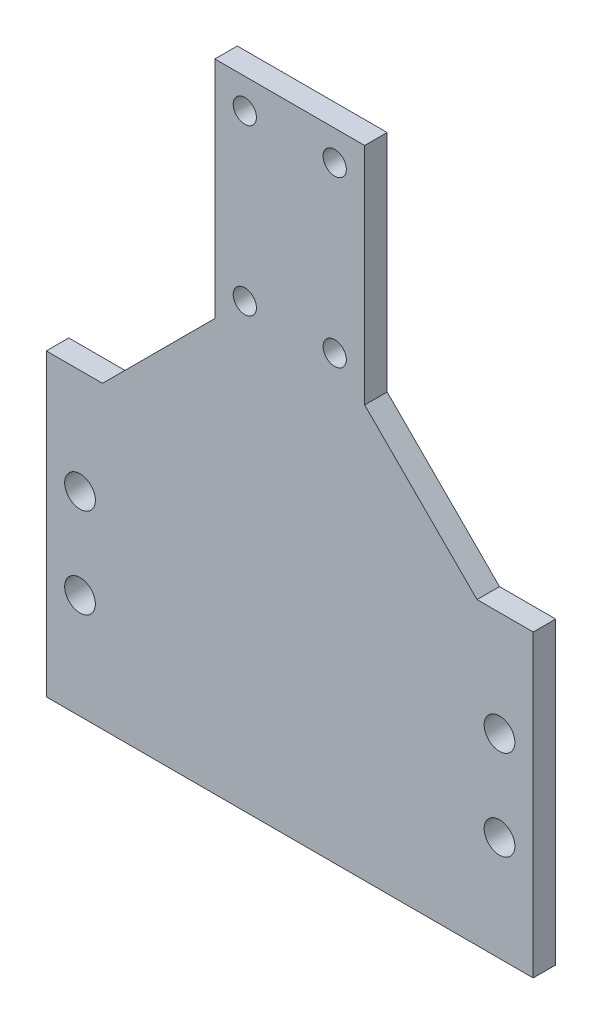
ISO-10303-21;
HEADER;
FILE_DESCRIPTION(('STEP AP214'),'2;1');
FILE_NAME('part.step','',(''),(''),'','','');
FILE_SCHEMA(('AUTOMOTIVE_DESIGN { 1 0 10303 214 1 1 1 1 }'));
ENDSEC;
DATA;
#1=APPLICATION_CONTEXT('core data for automotive mechanical design processes');
#2=APPLICATION_PROTOCOL_DEFINITION('international standard','automotive_design',2000,#1);
#3=PRODUCT_CONTEXT('',#1,'mechanical');
#4=PRODUCT('Part','Part','',(#3));
#5=PRODUCT_RELATED_PRODUCT_CATEGORY('part','',(#4));
#6=PRODUCT_DEFINITION_FORMATION('','',#4);
#7=PRODUCT_DEFINITION_CONTEXT('part definition',#1,'design');
#8=PRODUCT_DEFINITION('design','',#6,#7);
#9=PRODUCT_DEFINITION_SHAPE('','',#8);
#10=(LENGTH_UNIT() NAMED_UNIT(*) SI_UNIT(.MILLI.,.METRE.));
#11=(NAMED_UNIT(*) PLANE_ANGLE_UNIT() SI_UNIT($,.RADIAN.));
#12=(NAMED_UNIT(*) SI_UNIT($,.STERADIAN.) SOLID_ANGLE_UNIT());
#13=UNCERTAINTY_MEASURE_WITH_UNIT(LENGTH_MEASURE(1.E-05),#10,'distance_accuracy_value','');
#14=(GEOMETRIC_REPRESENTATION_CONTEXT(3) GLOBAL_UNCERTAINTY_ASSIGNED_CONTEXT((#13)) GLOBAL_UNIT_ASSIGNED_CONTEXT((#10,
#11,#12)) REPRESENTATION_CONTEXT('',''));
#15=CARTESIAN_POINT('',(0.,0.,0.));
#16=DIRECTION('',(0.,0.,1.));
#17=DIRECTION('',(1.,0.,0.));
#18=AXIS2_PLACEMENT_3D('',#15,#16,#17);
#19=CARTESIAN_POINT('',(-32.5,40.,3.));
#20=DIRECTION('',(1.,0.,0.));
#21=DIRECTION('',(0.,1.,0.));
#22=AXIS2_PLACEMENT_3D('',#19,#20,#21);
#23=PLANE('',#22);
#24=DIRECTION('',(0.,-1.,0.));
#25=VECTOR('',#24,1.);
#26=CARTESIAN_POINT('',(-32.5,40.,0.));
#27=LINE('',#26,#25);
#28=CARTESIAN_POINT('',(-32.5,40.,0.));
#29=VERTEX_POINT('',#28);
#30=CARTESIAN_POINT('',(-32.5,0.,0.));
#31=VERTEX_POINT('',#30);
#32=EDGE_CURVE('E149',#29,#31,#27,.T.);
#33=ORIENTED_EDGE('',*,*,#32,.T.);
#34=DIRECTION('',(0.,0.,-1.));
#35=VECTOR('',#34,1.);
#36=CARTESIAN_POINT('',(-32.5,0.,3.));
#37=LINE('',#36,#35);
#38=CARTESIAN_POINT('',(-32.5,0.,3.));
#39=VERTEX_POINT('',#38);
#40=EDGE_CURVE('E11',#39,#31,#37,.T.);
#41=ORIENTED_EDGE('',*,*,#40,.F.);
#42=DIRECTION('',(0.,-1.,0.));
#43=VECTOR('',#42,1.);
#44=CARTESIAN_POINT('',(-32.5,40.,3.));
#45=LINE('',#44,#43);
#46=CARTESIAN_POINT('',(-32.5,40.,3.));
#47=VERTEX_POINT('',#46);
#48=EDGE_CURVE('E168',#47,#39,#45,.T.);
#49=ORIENTED_EDGE('',*,*,#48,.F.);
#50=DIRECTION('',(0.,0.,-1.));
#51=VECTOR('',#50,1.);
#52=CARTESIAN_POINT('',(-32.5,40.,3.));
#53=LINE('',#52,#51);
#54=EDGE_CURVE('E145',#47,#29,#53,.T.);
#55=ORIENTED_EDGE('',*,*,#54,.T.);
#56=EDGE_LOOP('',(#33,#41,#49,#55));
#57=FACE_BOUND('',#56,.T.);
#58=ADVANCED_FACE('F41',(#57),#23,.F.);
#59=CARTESIAN_POINT('',(-32.5,0.,3.));
#60=DIRECTION('',(0.,1.,0.));
#61=DIRECTION('',(0.,0.,1.));
#62=AXIS2_PLACEMENT_3D('',#59,#60,#61);
#63=PLANE('',#62);
#64=DIRECTION('',(1.,0.,0.));
#65=VECTOR('',#64,1.);
#66=CARTESIAN_POINT('',(-32.5,0.,0.));
#67=LINE('',#66,#65);
#68=CARTESIAN_POINT('',(32.5,0.,0.));
#69=VERTEX_POINT('',#68);
#70=EDGE_CURVE('E152',#31,#69,#67,.T.);
#71=ORIENTED_EDGE('',*,*,#70,.T.);
#72=DIRECTION('',(0.,0.,-1.));
#73=VECTOR('',#72,1.);
#74=CARTESIAN_POINT('',(32.5,0.,3.));
#75=LINE('',#74,#73);
#76=CARTESIAN_POINT('',(32.5,0.,3.));
#77=VERTEX_POINT('',#76);
#78=EDGE_CURVE('E49',#77,#69,#75,.T.);
#79=ORIENTED_EDGE('',*,*,#78,.F.);
#80=DIRECTION('',(1.,0.,0.));
#81=VECTOR('',#80,1.);
#82=CARTESIAN_POINT('',(-32.5,0.,3.));
#83=LINE('',#82,#81);
#84=EDGE_CURVE('E106',#39,#77,#83,.T.);
#85=ORIENTED_EDGE('',*,*,#84,.F.);
#86=ORIENTED_EDGE('',*,*,#40,.T.);
#87=EDGE_LOOP('',(#71,#79,#85,#86));
#88=FACE_BOUND('',#87,.T.);
#89=ADVANCED_FACE('F297',(#88),#63,.F.);
#90=CARTESIAN_POINT('',(32.5,40.,3.));
#91=DIRECTION('',(-1.,0.,0.));
#92=DIRECTION('',(0.,-1.,0.));
#93=AXIS2_PLACEMENT_3D('',#90,#91,#92);
#94=PLANE('',#93);
#95=DIRECTION('',(0.,1.,0.));
#96=VECTOR('',#95,1.);
#97=CARTESIAN_POINT('',(32.5,40.,0.));
#98=LINE('',#97,#96);
#99=CARTESIAN_POINT('',(32.5,40.,0.));
#100=VERTEX_POINT('',#99);
#101=EDGE_CURVE('E155',#69,#100,#98,.T.);
#102=ORIENTED_EDGE('',*,*,#101,.T.);
#103=DIRECTION('',(0.,0.,-1.));
#104=VECTOR('',#103,1.);
#105=CARTESIAN_POINT('',(32.5,40.,3.));
#106=LINE('',#105,#104);
#107=CARTESIAN_POINT('',(32.5,40.,3.));
#108=VERTEX_POINT('',#107);
#109=EDGE_CURVE('E181',#108,#100,#106,.T.);
#110=ORIENTED_EDGE('',*,*,#109,.F.);
#111=DIRECTION('',(0.,1.,0.));
#112=VECTOR('',#111,1.);
#113=CARTESIAN_POINT('',(32.5,40.,3.));
#114=LINE('',#113,#112);
#115=EDGE_CURVE('E189',#77,#108,#114,.T.);
#116=ORIENTED_EDGE('',*,*,#115,.F.);
#117=ORIENTED_EDGE('',*,*,#78,.T.);
#118=EDGE_LOOP('',(#102,#110,#116,#117));
#119=FACE_BOUND('',#118,.T.);
#120=ADVANCED_FACE('F187',(#119),#94,.F.);
#121=CARTESIAN_POINT('',(32.5,40.,3.));
#122=DIRECTION('',(0.,-1.,0.));
#123=DIRECTION('',(0.,0.,-1.));
#124=AXIS2_PLACEMENT_3D('',#121,#122,#123);
#125=PLANE('',#124);
#126=DIRECTION('',(-1.,0.,0.));
#127=VECTOR('',#126,1.);
#128=CARTESIAN_POINT('',(32.5,40.,0.));
#129=LINE('',#128,#127);
#130=CARTESIAN_POINT('',(25.,40.,0.));
#131=VERTEX_POINT('',#130);
#132=EDGE_CURVE('E157',#100,#131,#129,.T.);
#133=ORIENTED_EDGE('',*,*,#132,.T.);
#134=DIRECTION('',(0.,0.,-1.));
#135=VECTOR('',#134,1.);
#136=CARTESIAN_POINT('',(25.,40.,3.));
#137=LINE('',#136,#135);
#138=CARTESIAN_POINT('',(25.,40.,3.));
#139=VERTEX_POINT('',#138);
#140=EDGE_CURVE('E178',#139,#131,#137,.T.);
#141=ORIENTED_EDGE('',*,*,#140,.F.);
#142=DIRECTION('',(-1.,0.,0.));
#143=VECTOR('',#142,1.);
#144=CARTESIAN_POINT('',(32.5,40.,3.));
#145=LINE('',#144,#143);
#146=EDGE_CURVE('E207',#108,#139,#145,.T.);
#147=ORIENTED_EDGE('',*,*,#146,.F.);
#148=ORIENTED_EDGE('',*,*,#109,.T.);
#149=EDGE_LOOP('',(#133,#141,#147,#148));
#150=FACE_BOUND('',#149,.T.);
#151=ADVANCED_FACE('F198',(#150),#125,.F.);
#152=CARTESIAN_POINT('',(25.,40.,3.));
#153=DIRECTION('',(-0.707106781186548,-0.707106781186547,0.));
#154=DIRECTION('',(0.707106781186547,-0.707106781186548,0.));
#155=AXIS2_PLACEMENT_3D('',#152,#153,#154);
#156=PLANE('',#155);
#157=DIRECTION('',(-0.707106781186547,0.707106781186548,0.));
#158=VECTOR('',#157,1.);
#159=CARTESIAN_POINT('',(25.,40.,0.));
#160=LINE('',#159,#158);
#161=CARTESIAN_POINT('',(10.,55.,0.));
#162=VERTEX_POINT('',#161);
#163=EDGE_CURVE('E159',#131,#162,#160,.T.);
#164=ORIENTED_EDGE('',*,*,#163,.T.);
#165=DIRECTION('',(0.,0.,-1.));
#166=VECTOR('',#165,1.);
#167=CARTESIAN_POINT('',(10.,55.,3.));
#168=LINE('',#167,#166);
#169=CARTESIAN_POINT('',(10.,55.,3.));
#170=VERTEX_POINT('',#169);
#171=EDGE_CURVE('E175',#170,#162,#168,.T.);
#172=ORIENTED_EDGE('',*,*,#171,.F.);
#173=DIRECTION('',(-0.707106781186547,0.707106781186548,0.));
#174=VECTOR('',#173,1.);
#175=CARTESIAN_POINT('',(25.,40.,3.));
#176=LINE('',#175,#174);
#177=EDGE_CURVE('E204',#139,#170,#176,.T.);
#178=ORIENTED_EDGE('',*,*,#177,.F.);
#179=ORIENTED_EDGE('',*,*,#140,.T.);
#180=EDGE_LOOP('',(#164,#172,#178,#179));
#181=FACE_BOUND('',#180,.T.);
#182=ADVANCED_FACE('F202',(#181),#156,.F.);
#183=CARTESIAN_POINT('',(10.,55.,3.));
#184=DIRECTION('',(-1.,0.,0.));
#185=DIRECTION('',(0.,-1.,0.));
#186=AXIS2_PLACEMENT_3D('',#183,#184,#185);
#187=PLANE('',#186);
#188=DIRECTION('',(0.,1.,0.));
#189=VECTOR('',#188,1.);
#190=CARTESIAN_POINT('',(10.,55.,0.));
#191=LINE('',#190,#189);
#192=CARTESIAN_POINT('',(10.,85.,0.));
#193=VERTEX_POINT('',#192);
#194=EDGE_CURVE('E161',#162,#193,#191,.T.);
#195=ORIENTED_EDGE('',*,*,#194,.T.);
#196=DIRECTION('',(0.,0.,-1.));
#197=VECTOR('',#196,1.);
#198=CARTESIAN_POINT('',(10.,85.,3.));
#199=LINE('',#198,#197);
#200=CARTESIAN_POINT('',(10.,85.,3.));
#201=VERTEX_POINT('',#200);
#202=EDGE_CURVE('E172',#201,#193,#199,.T.);
#203=ORIENTED_EDGE('',*,*,#202,.F.);
#204=DIRECTION('',(0.,1.,0.));
#205=VECTOR('',#204,1.);
#206=CARTESIAN_POINT('',(10.,55.,3.));
#207=LINE('',#206,#205);
#208=EDGE_CURVE('E206',#170,#201,#207,.T.);
#209=ORIENTED_EDGE('',*,*,#208,.F.);
#210=ORIENTED_EDGE('',*,*,#171,.T.);
#211=EDGE_LOOP('',(#195,#203,#209,#210));
#212=FACE_BOUND('',#211,.T.);
#213=ADVANCED_FACE('F309',(#212),#187,.F.);
#214=CARTESIAN_POINT('',(-10.,85.,3.));
#215=DIRECTION('',(0.,-1.,0.));
#216=DIRECTION('',(0.,0.,-1.));
#217=AXIS2_PLACEMENT_3D('',#214,#215,#216);
#218=PLANE('',#217);
#219=DIRECTION('',(-1.,0.,0.));
#220=VECTOR('',#219,1.);
#221=CARTESIAN_POINT('',(-10.,85.,0.));
#222=LINE('',#221,#220);
#223=CARTESIAN_POINT('',(-10.,85.,0.));
#224=VERTEX_POINT('',#223);
#225=EDGE_CURVE('E163',#193,#224,#222,.T.);
#226=ORIENTED_EDGE('',*,*,#225,.T.);
#227=DIRECTION('',(0.,0.,-1.));
#228=VECTOR('',#227,1.);
#229=CARTESIAN_POINT('',(-10.,85.,3.));
#230=LINE('',#229,#228);
#231=CARTESIAN_POINT('',(-10.,85.,3.));
#232=VERTEX_POINT('',#231);
#233=EDGE_CURVE('E140',#232,#224,#230,.T.);
#234=ORIENTED_EDGE('',*,*,#233,.F.);
#235=DIRECTION('',(-1.,0.,0.));
#236=VECTOR('',#235,1.);
#237=CARTESIAN_POINT('',(-10.,85.,3.));
#238=LINE('',#237,#236);
#239=EDGE_CURVE('E131',#201,#232,#238,.T.);
#240=ORIENTED_EDGE('',*,*,#239,.F.);
#241=ORIENTED_EDGE('',*,*,#202,.T.);
#242=EDGE_LOOP('',(#226,#234,#240,#241));
#243=FACE_BOUND('',#242,.T.);
#244=ADVANCED_FACE('F306',(#243),#218,.F.);
#245=CARTESIAN_POINT('',(-10.,55.,3.));
#246=DIRECTION('',(1.,0.,0.));
#247=DIRECTION('',(0.,1.,0.));
#248=AXIS2_PLACEMENT_3D('',#245,#246,#247);
#249=PLANE('',#248);
#250=DIRECTION('',(0.,-1.,0.));
#251=VECTOR('',#250,1.);
#252=CARTESIAN_POINT('',(-10.,55.,0.));
#253=LINE('',#252,#251);
#254=CARTESIAN_POINT('',(-10.,55.,0.));
#255=VERTEX_POINT('',#254);
#256=EDGE_CURVE('E139',#224,#255,#253,.T.);
#257=ORIENTED_EDGE('',*,*,#256,.T.);
#258=DIRECTION('',(0.,0.,-1.));
#259=VECTOR('',#258,1.);
#260=CARTESIAN_POINT('',(-10.,55.,3.));
#261=LINE('',#260,#259);
#262=CARTESIAN_POINT('',(-10.,55.,3.));
#263=VERTEX_POINT('',#262);
#264=EDGE_CURVE('E136',#263,#255,#261,.T.);
#265=ORIENTED_EDGE('',*,*,#264,.F.);
#266=DIRECTION('',(0.,-1.,0.));
#267=VECTOR('',#266,1.);
#268=CARTESIAN_POINT('',(-10.,55.,3.));
#269=LINE('',#268,#267);
#270=EDGE_CURVE('E125',#232,#263,#269,.T.);
#271=ORIENTED_EDGE('',*,*,#270,.F.);
#272=ORIENTED_EDGE('',*,*,#233,.T.);
#273=EDGE_LOOP('',(#257,#265,#271,#272));
#274=FACE_BOUND('',#273,.T.);
#275=ADVANCED_FACE('F137',(#274),#249,.F.);
#276=CARTESIAN_POINT('',(-25.,40.,3.));
#277=DIRECTION('',(0.707106781186548,-0.707106781186547,0.));
#278=DIRECTION('',(0.707106781186547,0.707106781186548,0.));
#279=AXIS2_PLACEMENT_3D('',#276,#277,#278);
#280=PLANE('',#279);
#281=DIRECTION('',(-0.707106781186547,-0.707106781186548,0.));
#282=VECTOR('',#281,1.);
#283=CARTESIAN_POINT('',(-25.,40.,0.));
#284=LINE('',#283,#282);
#285=CARTESIAN_POINT('',(-25.,40.,0.));
#286=VERTEX_POINT('',#285);
#287=EDGE_CURVE('E92',#255,#286,#284,.T.);
#288=ORIENTED_EDGE('',*,*,#287,.T.);
#289=DIRECTION('',(0.,0.,-1.));
#290=VECTOR('',#289,1.);
#291=CARTESIAN_POINT('',(-25.,40.,3.));
#292=LINE('',#291,#290);
#293=CARTESIAN_POINT('',(-25.,40.,3.));
#294=VERTEX_POINT('',#293);
#295=EDGE_CURVE('E141',#294,#286,#292,.T.);
#296=ORIENTED_EDGE('',*,*,#295,.F.);
#297=DIRECTION('',(-0.707106781186547,-0.707106781186548,0.));
#298=VECTOR('',#297,1.);
#299=CARTESIAN_POINT('',(-25.,40.,3.));
#300=LINE('',#299,#298);
#301=EDGE_CURVE('E129',#263,#294,#300,.T.);
#302=ORIENTED_EDGE('',*,*,#301,.F.);
#303=ORIENTED_EDGE('',*,*,#264,.T.);
#304=EDGE_LOOP('',(#288,#296,#302,#303));
#305=FACE_BOUND('',#304,.T.);
#306=ADVANCED_FACE('F143',(#305),#280,.F.);
#307=CARTESIAN_POINT('',(-32.5,40.,3.));
#308=DIRECTION('',(0.,-1.,0.));
#309=DIRECTION('',(0.,0.,-1.));
#310=AXIS2_PLACEMENT_3D('',#307,#308,#309);
#311=PLANE('',#310);
#312=DIRECTION('',(-1.,0.,0.));
#313=VECTOR('',#312,1.);
#314=CARTESIAN_POINT('',(-32.5,40.,0.));
#315=LINE('',#314,#313);
#316=EDGE_CURVE('E98',#286,#29,#315,.T.);
#317=ORIENTED_EDGE('',*,*,#316,.T.);
#318=ORIENTED_EDGE('',*,*,#54,.F.);
#319=DIRECTION('',(-1.,0.,0.));
#320=VECTOR('',#319,1.);
#321=CARTESIAN_POINT('',(-32.5,40.,3.));
#322=LINE('',#321,#320);
#323=EDGE_CURVE('E57',#294,#47,#322,.T.);
#324=ORIENTED_EDGE('',*,*,#323,.F.);
#325=ORIENTED_EDGE('',*,*,#295,.T.);
#326=EDGE_LOOP('',(#317,#318,#324,#325));
#327=FACE_BOUND('',#326,.T.);
#328=ADVANCED_FACE('F267',(#327),#311,.F.);
#329=CARTESIAN_POINT('',(0.,0.,3.));
#330=DIRECTION('',(0.,0.,1.));
#331=DIRECTION('',(1.,0.,0.));
#332=AXIS2_PLACEMENT_3D('',#329,#330,#331);
#333=PLANE('',#332);
#334=CARTESIAN_POINT('',(28.,26.,3.));
#335=DIRECTION('',(0.,0.,1.));
#336=DIRECTION('',(-1.,0.,0.));
#337=AXIS2_PLACEMENT_3D('',#334,#335,#336);
#338=CIRCLE('',#337,2.05);
#339=CARTESIAN_POINT('',(25.95,26.,3.));
#340=VERTEX_POINT('',#339);
#341=EDGE_CURVE('E248',#340,#340,#338,.T.);
#342=ORIENTED_EDGE('',*,*,#341,.F.);
#343=EDGE_LOOP('',(#342));
#344=FACE_BOUND('',#343,.T.);
#345=CARTESIAN_POINT('',(28.,14.,3.));
#346=DIRECTION('',(0.,0.,1.));
#347=DIRECTION('',(1.,0.,0.));
#348=AXIS2_PLACEMENT_3D('',#345,#346,#347);
#349=CIRCLE('',#348,2.05);
#350=CARTESIAN_POINT('',(30.05,14.,3.));
#351=VERTEX_POINT('',#350);
#352=EDGE_CURVE('E254',#351,#351,#349,.T.);
#353=ORIENTED_EDGE('',*,*,#352,.F.);
#354=EDGE_LOOP('',(#353));
#355=FACE_BOUND('',#354,.T.);
#356=CARTESIAN_POINT('',(-28.,14.,3.));
#357=DIRECTION('',(0.,0.,1.));
#358=DIRECTION('',(-1.,0.,0.));
#359=AXIS2_PLACEMENT_3D('',#356,#357,#358);
#360=CIRCLE('',#359,2.05);
#361=CARTESIAN_POINT('',(-30.05,14.,3.));
#362=VERTEX_POINT('',#361);
#363=EDGE_CURVE('E242',#362,#362,#360,.T.);
#364=ORIENTED_EDGE('',*,*,#363,.F.);
#365=EDGE_LOOP('',(#364));
#366=FACE_BOUND('',#365,.T.);
#367=CARTESIAN_POINT('',(-28.,26.,3.));
#368=DIRECTION('',(0.,0.,1.));
#369=DIRECTION('',(1.,0.,0.));
#370=AXIS2_PLACEMENT_3D('',#367,#368,#369);
#371=CIRCLE('',#370,2.05);
#372=CARTESIAN_POINT('',(-25.95,26.,3.));
#373=VERTEX_POINT('',#372);
#374=EDGE_CURVE('E239',#373,#373,#371,.T.);
#375=ORIENTED_EDGE('',*,*,#374,.F.);
#376=EDGE_LOOP('',(#375));
#377=FACE_BOUND('',#376,.T.);
#378=CARTESIAN_POINT('',(6.00000000000001,81.,3.));
#379=DIRECTION('',(0.,0.,1.));
#380=DIRECTION('',(-1.,0.,0.));
#381=AXIS2_PLACEMENT_3D('',#378,#379,#380);
#382=CIRCLE('',#381,1.54999999999999);
#383=CARTESIAN_POINT('',(4.45000000000001,81.,3.));
#384=VERTEX_POINT('',#383);
#385=EDGE_CURVE('E224',#384,#384,#382,.T.);
#386=ORIENTED_EDGE('',*,*,#385,.F.);
#387=EDGE_LOOP('',(#386));
#388=FACE_BOUND('',#387,.T.);
#389=CARTESIAN_POINT('',(6.00000000000001,59.,3.));
#390=DIRECTION('',(0.,0.,1.));
#391=DIRECTION('',(1.,0.,0.));
#392=AXIS2_PLACEMENT_3D('',#389,#390,#391);
#393=CIRCLE('',#392,1.55);
#394=CARTESIAN_POINT('',(7.55000000000001,59.,3.));
#395=VERTEX_POINT('',#394);
#396=EDGE_CURVE('E231',#395,#395,#393,.T.);
#397=ORIENTED_EDGE('',*,*,#396,.F.);
#398=EDGE_LOOP('',(#397));
#399=FACE_BOUND('',#398,.T.);
#400=CARTESIAN_POINT('',(-6.,59.,3.));
#401=DIRECTION('',(0.,0.,1.));
#402=DIRECTION('',(-1.,0.,0.));
#403=AXIS2_PLACEMENT_3D('',#400,#401,#402);
#404=CIRCLE('',#403,1.55);
#405=CARTESIAN_POINT('',(-7.55,59.,3.));
#406=VERTEX_POINT('',#405);
#407=EDGE_CURVE('E218',#406,#406,#404,.T.);
#408=ORIENTED_EDGE('',*,*,#407,.F.);
#409=EDGE_LOOP('',(#408));
#410=FACE_BOUND('',#409,.T.);
#411=CARTESIAN_POINT('',(-6.,81.,3.));
#412=DIRECTION('',(0.,0.,1.));
#413=DIRECTION('',(1.,0.,0.));
#414=AXIS2_PLACEMENT_3D('',#411,#412,#413);
#415=CIRCLE('',#414,1.54999999999999);
#416=CARTESIAN_POINT('',(-4.45000000000001,81.,3.));
#417=VERTEX_POINT('',#416);
#418=EDGE_CURVE('E215',#417,#417,#415,.T.);
#419=ORIENTED_EDGE('',*,*,#418,.F.);
#420=EDGE_LOOP('',(#419));
#421=FACE_BOUND('',#420,.T.);
#422=ORIENTED_EDGE('',*,*,#48,.T.);
#423=ORIENTED_EDGE('',*,*,#84,.T.);
#424=ORIENTED_EDGE('',*,*,#115,.T.);
#425=ORIENTED_EDGE('',*,*,#146,.T.);
#426=ORIENTED_EDGE('',*,*,#177,.T.);
#427=ORIENTED_EDGE('',*,*,#208,.T.);
#428=ORIENTED_EDGE('',*,*,#239,.T.);
#429=ORIENTED_EDGE('',*,*,#270,.T.);
#430=ORIENTED_EDGE('',*,*,#301,.T.);
#431=ORIENTED_EDGE('',*,*,#323,.T.);
#432=EDGE_LOOP('',(#422,#423,#424,#425,#426,#427,#428,#429,#430,#431));
#433=FACE_BOUND('',#432,.T.);
#434=ADVANCED_FACE('F127',(#344,#355,#366,#377,#388,#399,#410,#421,#433),#333,.T.);
#435=CARTESIAN_POINT('',(0.,0.,0.));
#436=DIRECTION('',(0.,0.,1.));
#437=DIRECTION('',(1.,0.,0.));
#438=AXIS2_PLACEMENT_3D('',#435,#436,#437);
#439=PLANE('',#438);
#440=CARTESIAN_POINT('',(28.,26.,0.));
#441=DIRECTION('',(0.,0.,1.));
#442=DIRECTION('',(-1.,0.,0.));
#443=AXIS2_PLACEMENT_3D('',#440,#441,#442);
#444=CIRCLE('',#443,2.05);
#445=CARTESIAN_POINT('',(25.95,26.,0.));
#446=VERTEX_POINT('',#445);
#447=EDGE_CURVE('E245',#446,#446,#444,.T.);
#448=ORIENTED_EDGE('',*,*,#447,.T.);
#449=EDGE_LOOP('',(#448));
#450=FACE_BOUND('',#449,.T.);
#451=CARTESIAN_POINT('',(28.,14.,0.));
#452=DIRECTION('',(0.,0.,1.));
#453=DIRECTION('',(1.,0.,0.));
#454=AXIS2_PLACEMENT_3D('',#451,#452,#453);
#455=CIRCLE('',#454,2.05);
#456=CARTESIAN_POINT('',(30.05,14.,0.));
#457=VERTEX_POINT('',#456);
#458=EDGE_CURVE('E251',#457,#457,#455,.T.);
#459=ORIENTED_EDGE('',*,*,#458,.T.);
#460=EDGE_LOOP('',(#459));
#461=FACE_BOUND('',#460,.T.);
#462=CARTESIAN_POINT('',(-28.,14.,0.));
#463=DIRECTION('',(0.,0.,1.));
#464=DIRECTION('',(-1.,0.,0.));
#465=AXIS2_PLACEMENT_3D('',#462,#463,#464);
#466=CIRCLE('',#465,2.05);
#467=CARTESIAN_POINT('',(-30.05,14.,0.));
#468=VERTEX_POINT('',#467);
#469=EDGE_CURVE('E257',#468,#468,#466,.T.);
#470=ORIENTED_EDGE('',*,*,#469,.T.);
#471=EDGE_LOOP('',(#470));
#472=FACE_BOUND('',#471,.T.);
#473=CARTESIAN_POINT('',(-28.,26.,0.));
#474=DIRECTION('',(0.,0.,1.));
#475=DIRECTION('',(1.,0.,0.));
#476=AXIS2_PLACEMENT_3D('',#473,#474,#475);
#477=CIRCLE('',#476,2.05);
#478=CARTESIAN_POINT('',(-25.95,26.,0.));
#479=VERTEX_POINT('',#478);
#480=EDGE_CURVE('E225',#479,#479,#477,.T.);
#481=ORIENTED_EDGE('',*,*,#480,.T.);
#482=EDGE_LOOP('',(#481));
#483=FACE_BOUND('',#482,.T.);
#484=CARTESIAN_POINT('',(6.00000000000001,81.,0.));
#485=DIRECTION('',(0.,0.,1.));
#486=DIRECTION('',(-1.,0.,0.));
#487=AXIS2_PLACEMENT_3D('',#484,#485,#486);
#488=CIRCLE('',#487,1.54999999999999);
#489=CARTESIAN_POINT('',(4.45000000000001,81.,0.));
#490=VERTEX_POINT('',#489);
#491=EDGE_CURVE('E221',#490,#490,#488,.T.);
#492=ORIENTED_EDGE('',*,*,#491,.T.);
#493=EDGE_LOOP('',(#492));
#494=FACE_BOUND('',#493,.T.);
#495=CARTESIAN_POINT('',(6.00000000000001,59.,0.));
#496=DIRECTION('',(0.,0.,1.));
#497=DIRECTION('',(1.,0.,0.));
#498=AXIS2_PLACEMENT_3D('',#495,#496,#497);
#499=CIRCLE('',#498,1.55);
#500=CARTESIAN_POINT('',(7.55000000000001,59.,0.));
#501=VERTEX_POINT('',#500);
#502=EDGE_CURVE('E228',#501,#501,#499,.T.);
#503=ORIENTED_EDGE('',*,*,#502,.T.);
#504=EDGE_LOOP('',(#503));
#505=FACE_BOUND('',#504,.T.);
#506=CARTESIAN_POINT('',(-6.,59.,0.));
#507=DIRECTION('',(0.,0.,1.));
#508=DIRECTION('',(-1.,0.,0.));
#509=AXIS2_PLACEMENT_3D('',#506,#507,#508);
#510=CIRCLE('',#509,1.55);
#511=CARTESIAN_POINT('',(-7.55,59.,0.));
#512=VERTEX_POINT('',#511);
#513=EDGE_CURVE('E234',#512,#512,#510,.T.);
#514=ORIENTED_EDGE('',*,*,#513,.T.);
#515=EDGE_LOOP('',(#514));
#516=FACE_BOUND('',#515,.T.);
#517=CARTESIAN_POINT('',(-6.,81.,0.));
#518=DIRECTION('',(0.,0.,1.));
#519=DIRECTION('',(1.,0.,0.));
#520=AXIS2_PLACEMENT_3D('',#517,#518,#519);
#521=CIRCLE('',#520,1.54999999999999);
#522=CARTESIAN_POINT('',(-4.45000000000001,81.,0.));
#523=VERTEX_POINT('',#522);
#524=EDGE_CURVE('E153',#523,#523,#521,.T.);
#525=ORIENTED_EDGE('',*,*,#524,.T.);
#526=EDGE_LOOP('',(#525));
#527=FACE_BOUND('',#526,.T.);
#528=ORIENTED_EDGE('',*,*,#32,.F.);
#529=ORIENTED_EDGE('',*,*,#316,.F.);
#530=ORIENTED_EDGE('',*,*,#287,.F.);
#531=ORIENTED_EDGE('',*,*,#256,.F.);
#532=ORIENTED_EDGE('',*,*,#225,.F.);
#533=ORIENTED_EDGE('',*,*,#194,.F.);
#534=ORIENTED_EDGE('',*,*,#163,.F.);
#535=ORIENTED_EDGE('',*,*,#132,.F.);
#536=ORIENTED_EDGE('',*,*,#101,.F.);
#537=ORIENTED_EDGE('',*,*,#70,.F.);
#538=EDGE_LOOP('',(#528,#529,#530,#531,#532,#533,#534,#535,#536,#537));
#539=FACE_BOUND('',#538,.T.);
#540=ADVANCED_FACE('F193',(#450,#461,#472,#483,#494,#505,#516,#527,#539),#439,.F.);
#541=CARTESIAN_POINT('',(-6.,81.,0.));
#542=DIRECTION('',(0.,0.,1.));
#543=DIRECTION('',(1.,0.,0.));
#544=AXIS2_PLACEMENT_3D('',#541,#542,#543);
#545=CYLINDRICAL_SURFACE('',#544,1.54999999999999);
#546=ORIENTED_EDGE('',*,*,#524,.F.);
#547=EDGE_LOOP('',(#546));
#548=FACE_BOUND('',#547,.T.);
#549=ORIENTED_EDGE('',*,*,#418,.T.);
#550=EDGE_LOOP('',(#549));
#551=FACE_BOUND('',#550,.T.);
#552=ADVANCED_FACE('F280',(#548,#551),#545,.F.);
#553=CARTESIAN_POINT('',(-6.,59.,0.));
#554=DIRECTION('',(0.,0.,1.));
#555=DIRECTION('',(1.,0.,0.));
#556=AXIS2_PLACEMENT_3D('',#553,#554,#555);
#557=CYLINDRICAL_SURFACE('',#556,1.55);
#558=ORIENTED_EDGE('',*,*,#513,.F.);
#559=EDGE_LOOP('',(#558));
#560=FACE_BOUND('',#559,.T.);
#561=ORIENTED_EDGE('',*,*,#407,.T.);
#562=EDGE_LOOP('',(#561));
#563=FACE_BOUND('',#562,.T.);
#564=ADVANCED_FACE('F282',(#560,#563),#557,.F.);
#565=CARTESIAN_POINT('',(6.00000000000001,59.,0.));
#566=DIRECTION('',(0.,0.,1.));
#567=DIRECTION('',(1.,0.,0.));
#568=AXIS2_PLACEMENT_3D('',#565,#566,#567);
#569=CYLINDRICAL_SURFACE('',#568,1.55);
#570=ORIENTED_EDGE('',*,*,#502,.F.);
#571=EDGE_LOOP('',(#570));
#572=FACE_BOUND('',#571,.T.);
#573=ORIENTED_EDGE('',*,*,#396,.T.);
#574=EDGE_LOOP('',(#573));
#575=FACE_BOUND('',#574,.T.);
#576=ADVANCED_FACE('F289',(#572,#575),#569,.F.);
#577=CARTESIAN_POINT('',(6.00000000000001,81.,0.));
#578=DIRECTION('',(0.,0.,1.));
#579=DIRECTION('',(1.,0.,0.));
#580=AXIS2_PLACEMENT_3D('',#577,#578,#579);
#581=CYLINDRICAL_SURFACE('',#580,1.54999999999999);
#582=ORIENTED_EDGE('',*,*,#491,.F.);
#583=EDGE_LOOP('',(#582));
#584=FACE_BOUND('',#583,.T.);
#585=ORIENTED_EDGE('',*,*,#385,.T.);
#586=EDGE_LOOP('',(#585));
#587=FACE_BOUND('',#586,.T.);
#588=ADVANCED_FACE('F397',(#584,#587),#581,.F.);
#589=CARTESIAN_POINT('',(-28.,26.,0.));
#590=DIRECTION('',(0.,0.,1.));
#591=DIRECTION('',(1.,0.,0.));
#592=AXIS2_PLACEMENT_3D('',#589,#590,#591);
#593=CYLINDRICAL_SURFACE('',#592,2.05);
#594=ORIENTED_EDGE('',*,*,#480,.F.);
#595=EDGE_LOOP('',(#594));
#596=FACE_BOUND('',#595,.T.);
#597=ORIENTED_EDGE('',*,*,#374,.T.);
#598=EDGE_LOOP('',(#597));
#599=FACE_BOUND('',#598,.T.);
#600=ADVANCED_FACE('F408',(#596,#599),#593,.F.);
#601=CARTESIAN_POINT('',(-28.,14.,0.));
#602=DIRECTION('',(0.,0.,1.));
#603=DIRECTION('',(1.,0.,0.));
#604=AXIS2_PLACEMENT_3D('',#601,#602,#603);
#605=CYLINDRICAL_SURFACE('',#604,2.05);
#606=ORIENTED_EDGE('',*,*,#469,.F.);
#607=EDGE_LOOP('',(#606));
#608=FACE_BOUND('',#607,.T.);
#609=ORIENTED_EDGE('',*,*,#363,.T.);
#610=EDGE_LOOP('',(#609));
#611=FACE_BOUND('',#610,.T.);
#612=ADVANCED_FACE('F263',(#608,#611),#605,.F.);
#613=CARTESIAN_POINT('',(28.,14.,0.));
#614=DIRECTION('',(0.,0.,1.));
#615=DIRECTION('',(1.,0.,0.));
#616=AXIS2_PLACEMENT_3D('',#613,#614,#615);
#617=CYLINDRICAL_SURFACE('',#616,2.05);
#618=ORIENTED_EDGE('',*,*,#458,.F.);
#619=EDGE_LOOP('',(#618));
#620=FACE_BOUND('',#619,.T.);
#621=ORIENTED_EDGE('',*,*,#352,.T.);
#622=EDGE_LOOP('',(#621));
#623=FACE_BOUND('',#622,.T.);
#624=ADVANCED_FACE('F440',(#620,#623),#617,.F.);
#625=CARTESIAN_POINT('',(28.,26.,0.));
#626=DIRECTION('',(0.,0.,1.));
#627=DIRECTION('',(1.,0.,0.));
#628=AXIS2_PLACEMENT_3D('',#625,#626,#627);
#629=CYLINDRICAL_SURFACE('',#628,2.05);
#630=ORIENTED_EDGE('',*,*,#447,.F.);
#631=EDGE_LOOP('',(#630));
#632=FACE_BOUND('',#631,.T.);
#633=ORIENTED_EDGE('',*,*,#341,.T.);
#634=EDGE_LOOP('',(#633));
#635=FACE_BOUND('',#634,.T.);
#636=ADVANCED_FACE('F451',(#632,#635),#629,.F.);
#637=CLOSED_SHELL('',(#58,#89,#120,#151,#182,#213,#244,#275,#306,#328,#434,#540,#552,#564,#576,
#588,#600,#612,#624,#636));
#638=MANIFOLD_SOLID_BREP('B2',#637);
#639=ADVANCED_BREP_SHAPE_REPRESENTATION('',(#18,#638),#14);
#640=SHAPE_DEFINITION_REPRESENTATION(#9,#639);
ENDSEC;
END-ISO-10303-21;
